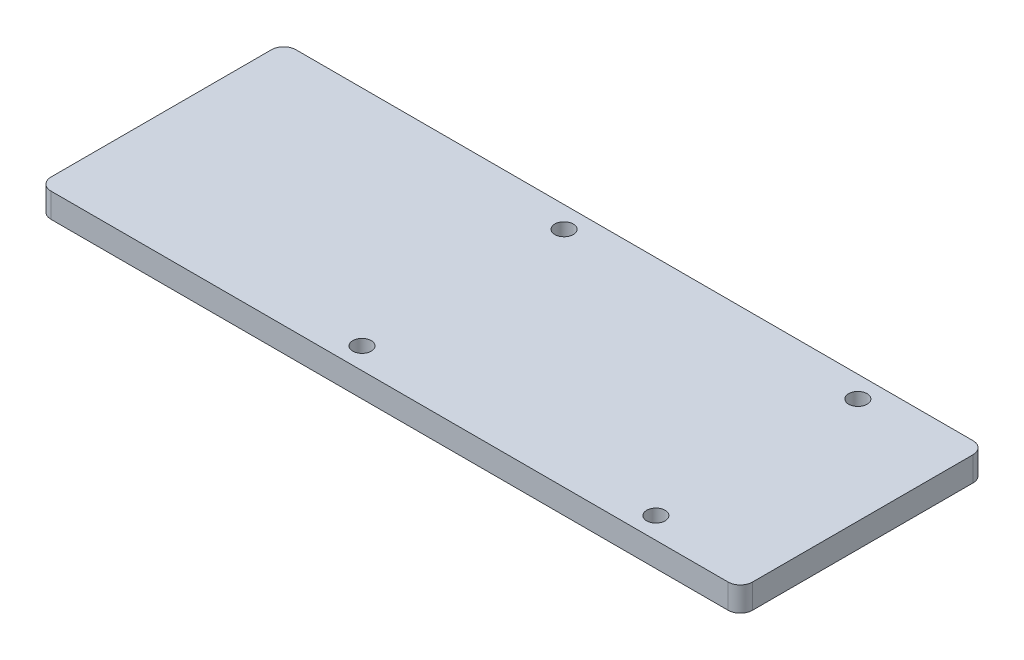
ISO-10303-21;
HEADER;
FILE_DESCRIPTION(('STEP AP214'),'2;1');
FILE_NAME('part.step','',(''),(''),'','','');
FILE_SCHEMA(('AUTOMOTIVE_DESIGN { 1 0 10303 214 1 1 1 1 }'));
ENDSEC;
DATA;
#1=APPLICATION_CONTEXT('core data for automotive mechanical design processes');
#2=APPLICATION_PROTOCOL_DEFINITION('international standard','automotive_design',2000,#1);
#3=PRODUCT_CONTEXT('',#1,'mechanical');
#4=PRODUCT('Part','Part','',(#3));
#5=PRODUCT_RELATED_PRODUCT_CATEGORY('part','',(#4));
#6=PRODUCT_DEFINITION_FORMATION('','',#4);
#7=PRODUCT_DEFINITION_CONTEXT('part definition',#1,'design');
#8=PRODUCT_DEFINITION('design','',#6,#7);
#9=PRODUCT_DEFINITION_SHAPE('','',#8);
#10=(LENGTH_UNIT() NAMED_UNIT(*) SI_UNIT(.MILLI.,.METRE.));
#11=(NAMED_UNIT(*) PLANE_ANGLE_UNIT() SI_UNIT($,.RADIAN.));
#12=(NAMED_UNIT(*) SI_UNIT($,.STERADIAN.) SOLID_ANGLE_UNIT());
#13=UNCERTAINTY_MEASURE_WITH_UNIT(LENGTH_MEASURE(1.E-05),#10,'distance_accuracy_value','');
#14=(GEOMETRIC_REPRESENTATION_CONTEXT(3) GLOBAL_UNCERTAINTY_ASSIGNED_CONTEXT((#13)) GLOBAL_UNIT_ASSIGNED_CONTEXT((#10,
#11,#12)) REPRESENTATION_CONTEXT('',''));
#15=CARTESIAN_POINT('',(0.,0.,0.));
#16=DIRECTION('',(0.,0.,1.));
#17=DIRECTION('',(1.,0.,0.));
#18=AXIS2_PLACEMENT_3D('',#15,#16,#17);
#19=CARTESIAN_POINT('',(181.900000055,12.7,63.5));
#20=DIRECTION('',(-1.,0.,0.));
#21=DIRECTION('',(0.,0.,1.));
#22=AXIS2_PLACEMENT_3D('',#19,#20,#21);
#23=PLANE('',#22);
#24=DIRECTION('',(0.,0.,-1.));
#25=VECTOR('',#24,1.);
#26=CARTESIAN_POINT('',(181.900000055,0.,63.5));
#27=LINE('',#26,#25);
#28=CARTESIAN_POINT('',(181.900000055,0.,57.15));
#29=VERTEX_POINT('',#28);
#30=CARTESIAN_POINT('',(181.900000055,0.,-57.15));
#31=VERTEX_POINT('',#30);
#32=EDGE_CURVE('E128',#29,#31,#27,.T.);
#33=ORIENTED_EDGE('',*,*,#32,.T.);
#34=DIRECTION('',(0.,-1.,0.));
#35=VECTOR('',#34,1.);
#36=CARTESIAN_POINT('',(181.900000055,12.7,-57.15));
#37=LINE('',#36,#35);
#38=CARTESIAN_POINT('',(181.900000055,12.7,-57.15));
#39=VERTEX_POINT('',#38);
#40=EDGE_CURVE('E151',#31,#39,#37,.F.);
#41=ORIENTED_EDGE('',*,*,#40,.T.);
#42=DIRECTION('',(0.,0.,-1.));
#43=VECTOR('',#42,1.);
#44=CARTESIAN_POINT('',(181.900000055,12.7,63.5));
#45=LINE('',#44,#43);
#46=CARTESIAN_POINT('',(181.900000055,12.7,57.15));
#47=VERTEX_POINT('',#46);
#48=EDGE_CURVE('E126',#47,#39,#45,.T.);
#49=ORIENTED_EDGE('',*,*,#48,.F.);
#50=DIRECTION('',(0.,-1.,0.));
#51=VECTOR('',#50,1.);
#52=CARTESIAN_POINT('',(181.900000055,12.7,57.15));
#53=LINE('',#52,#51);
#54=EDGE_CURVE('E148',#47,#29,#53,.T.);
#55=ORIENTED_EDGE('',*,*,#54,.T.);
#56=EDGE_LOOP('',(#33,#41,#49,#55));
#57=FACE_BOUND('',#56,.T.);
#58=ADVANCED_FACE('F33',(#57),#23,.F.);
#59=CARTESIAN_POINT('',(-181.900000055,12.7,-63.5));
#60=DIRECTION('',(0.,0.,1.));
#61=DIRECTION('',(1.,0.,0.));
#62=AXIS2_PLACEMENT_3D('',#59,#60,#61);
#63=PLANE('',#62);
#64=DIRECTION('',(-1.,0.,0.));
#65=VECTOR('',#64,1.);
#66=CARTESIAN_POINT('',(-181.900000055,0.,-63.5));
#67=LINE('',#66,#65);
#68=CARTESIAN_POINT('',(175.550000055,0.,-63.5));
#69=VERTEX_POINT('',#68);
#70=CARTESIAN_POINT('',(-175.550000055,0.,-63.5));
#71=VERTEX_POINT('',#70);
#72=EDGE_CURVE('E124',#69,#71,#67,.T.);
#73=ORIENTED_EDGE('',*,*,#72,.T.);
#74=DIRECTION('',(0.,-1.,0.));
#75=VECTOR('',#74,1.);
#76=CARTESIAN_POINT('',(-175.550000055,12.7,-63.5));
#77=LINE('',#76,#75);
#78=CARTESIAN_POINT('',(-175.550000055,12.7,-63.5));
#79=VERTEX_POINT('',#78);
#80=EDGE_CURVE('E103',#71,#79,#77,.F.);
#81=ORIENTED_EDGE('',*,*,#80,.T.);
#82=DIRECTION('',(-1.,0.,0.));
#83=VECTOR('',#82,1.);
#84=CARTESIAN_POINT('',(-181.900000055,12.7,-63.5));
#85=LINE('',#84,#83);
#86=CARTESIAN_POINT('',(175.550000055,12.7,-63.5));
#87=VERTEX_POINT('',#86);
#88=EDGE_CURVE('E167',#87,#79,#85,.T.);
#89=ORIENTED_EDGE('',*,*,#88,.F.);
#90=DIRECTION('',(0.,-1.,0.));
#91=VECTOR('',#90,1.);
#92=CARTESIAN_POINT('',(175.550000055,12.7,-63.5));
#93=LINE('',#92,#91);
#94=EDGE_CURVE('E108',#87,#69,#93,.T.);
#95=ORIENTED_EDGE('',*,*,#94,.T.);
#96=EDGE_LOOP('',(#73,#81,#89,#95));
#97=FACE_BOUND('',#96,.T.);
#98=ADVANCED_FACE('F219',(#97),#63,.F.);
#99=CARTESIAN_POINT('',(-181.900000055,12.7,63.5));
#100=DIRECTION('',(1.,0.,0.));
#101=DIRECTION('',(0.,0.,-1.));
#102=AXIS2_PLACEMENT_3D('',#99,#100,#101);
#103=PLANE('',#102);
#104=DIRECTION('',(0.,0.,1.));
#105=VECTOR('',#104,1.);
#106=CARTESIAN_POINT('',(-181.900000055,12.7,63.5));
#107=LINE('',#106,#105);
#108=CARTESIAN_POINT('',(-181.900000055,12.7,-57.15));
#109=VERTEX_POINT('',#108);
#110=CARTESIAN_POINT('',(-181.900000055,12.7,57.15));
#111=VERTEX_POINT('',#110);
#112=EDGE_CURVE('E117',#109,#111,#107,.T.);
#113=ORIENTED_EDGE('',*,*,#112,.F.);
#114=DIRECTION('',(0.,-1.,0.));
#115=VECTOR('',#114,1.);
#116=CARTESIAN_POINT('',(-181.900000055,12.7,-57.15));
#117=LINE('',#116,#115);
#118=CARTESIAN_POINT('',(-181.900000055,0.,-57.15));
#119=VERTEX_POINT('',#118);
#120=EDGE_CURVE('E102',#109,#119,#117,.T.);
#121=ORIENTED_EDGE('',*,*,#120,.T.);
#122=DIRECTION('',(0.,0.,1.));
#123=VECTOR('',#122,1.);
#124=CARTESIAN_POINT('',(-181.900000055,0.,63.5));
#125=LINE('',#124,#123);
#126=CARTESIAN_POINT('',(-181.900000055,0.,57.15));
#127=VERTEX_POINT('',#126);
#128=EDGE_CURVE('E115',#119,#127,#125,.T.);
#129=ORIENTED_EDGE('',*,*,#128,.T.);
#130=DIRECTION('',(0.,-1.,0.));
#131=VECTOR('',#130,1.);
#132=CARTESIAN_POINT('',(-181.900000055,12.7,57.15));
#133=LINE('',#132,#131);
#134=EDGE_CURVE('E119',#127,#111,#133,.F.);
#135=ORIENTED_EDGE('',*,*,#134,.T.);
#136=EDGE_LOOP('',(#113,#121,#129,#135));
#137=FACE_BOUND('',#136,.T.);
#138=ADVANCED_FACE('F114',(#137),#103,.F.);
#139=CARTESIAN_POINT('',(-181.900000055,12.7,63.5));
#140=DIRECTION('',(0.,0.,-1.));
#141=DIRECTION('',(-1.,0.,0.));
#142=AXIS2_PLACEMENT_3D('',#139,#140,#141);
#143=PLANE('',#142);
#144=DIRECTION('',(1.,0.,0.));
#145=VECTOR('',#144,1.);
#146=CARTESIAN_POINT('',(-181.900000055,0.,63.5));
#147=LINE('',#146,#145);
#148=CARTESIAN_POINT('',(-175.550000055,0.,63.5));
#149=VERTEX_POINT('',#148);
#150=CARTESIAN_POINT('',(175.550000055,0.,63.5));
#151=VERTEX_POINT('',#150);
#152=EDGE_CURVE('E123',#149,#151,#147,.T.);
#153=ORIENTED_EDGE('',*,*,#152,.T.);
#154=DIRECTION('',(0.,-1.,0.));
#155=VECTOR('',#154,1.);
#156=CARTESIAN_POINT('',(175.550000055,12.7,63.5));
#157=LINE('',#156,#155);
#158=CARTESIAN_POINT('',(175.550000055,12.7,63.5));
#159=VERTEX_POINT('',#158);
#160=EDGE_CURVE('E11',#151,#159,#157,.F.);
#161=ORIENTED_EDGE('',*,*,#160,.T.);
#162=DIRECTION('',(1.,0.,0.));
#163=VECTOR('',#162,1.);
#164=CARTESIAN_POINT('',(-181.900000055,12.7,63.5));
#165=LINE('',#164,#163);
#166=CARTESIAN_POINT('',(-175.550000055,12.7,63.5));
#167=VERTEX_POINT('',#166);
#168=EDGE_CURVE('E132',#167,#159,#165,.T.);
#169=ORIENTED_EDGE('',*,*,#168,.F.);
#170=DIRECTION('',(0.,-1.,0.));
#171=VECTOR('',#170,1.);
#172=CARTESIAN_POINT('',(-175.550000055,12.7,63.5));
#173=LINE('',#172,#171);
#174=EDGE_CURVE('E41',#167,#149,#173,.T.);
#175=ORIENTED_EDGE('',*,*,#174,.T.);
#176=EDGE_LOOP('',(#153,#161,#169,#175));
#177=FACE_BOUND('',#176,.T.);
#178=ADVANCED_FACE('F154',(#177),#143,.F.);
#179=CARTESIAN_POINT('',(0.,12.7,0.));
#180=DIRECTION('',(0.,-1.,0.));
#181=DIRECTION('',(0.,0.,-1.));
#182=AXIS2_PLACEMENT_3D('',#179,#180,#181);
#183=PLANE('',#182);
#184=CARTESIAN_POINT('',(127.,12.7,-52.3748000000001));
#185=DIRECTION('',(0.,1.,0.));
#186=DIRECTION('',(0.,0.,-1.));
#187=AXIS2_PLACEMENT_3D('',#184,#185,#186);
#188=CIRCLE('',#187,4.77520000000001);
#189=CARTESIAN_POINT('',(127.,12.7,-57.1500000000001));
#190=VERTEX_POINT('',#189);
#191=EDGE_CURVE('E183',#190,#190,#188,.T.);
#192=ORIENTED_EDGE('',*,*,#191,.F.);
#193=EDGE_LOOP('',(#192));
#194=FACE_BOUND('',#193,.T.);
#195=CARTESIAN_POINT('',(127.,12.7,52.3748));
#196=DIRECTION('',(0.,1.,0.));
#197=DIRECTION('',(0.,0.,1.));
#198=AXIS2_PLACEMENT_3D('',#195,#196,#197);
#199=CIRCLE('',#198,4.77520000000001);
#200=CARTESIAN_POINT('',(127.,12.7,57.15));
#201=VERTEX_POINT('',#200);
#202=EDGE_CURVE('E189',#201,#201,#199,.T.);
#203=ORIENTED_EDGE('',*,*,#202,.F.);
#204=EDGE_LOOP('',(#203));
#205=FACE_BOUND('',#204,.T.);
#206=CARTESIAN_POINT('',(-25.4,12.7,52.3748));
#207=DIRECTION('',(0.,1.,0.));
#208=DIRECTION('',(0.,0.,-1.));
#209=AXIS2_PLACEMENT_3D('',#206,#207,#208);
#210=CIRCLE('',#209,4.77520000000001);
#211=CARTESIAN_POINT('',(-25.4,12.7,47.5996));
#212=VERTEX_POINT('',#211);
#213=EDGE_CURVE('E195',#212,#212,#210,.T.);
#214=ORIENTED_EDGE('',*,*,#213,.F.);
#215=EDGE_LOOP('',(#214));
#216=FACE_BOUND('',#215,.T.);
#217=CARTESIAN_POINT('',(-25.4,12.7,-52.3748));
#218=DIRECTION('',(0.,1.,0.));
#219=DIRECTION('',(0.,0.,1.));
#220=AXIS2_PLACEMENT_3D('',#217,#218,#219);
#221=CIRCLE('',#220,4.7752);
#222=CARTESIAN_POINT('',(-25.4,12.7,-47.5996));
#223=VERTEX_POINT('',#222);
#224=EDGE_CURVE('E172',#223,#223,#221,.T.);
#225=ORIENTED_EDGE('',*,*,#224,.F.);
#226=EDGE_LOOP('',(#225));
#227=FACE_BOUND('',#226,.T.);
#228=ORIENTED_EDGE('',*,*,#88,.T.);
#229=CARTESIAN_POINT('',(-175.550000055,12.7,-57.15));
#230=DIRECTION('',(0.,-1.,0.));
#231=DIRECTION('',(0.,0.,-1.));
#232=AXIS2_PLACEMENT_3D('',#229,#230,#231);
#233=CIRCLE('',#232,6.35);
#234=EDGE_CURVE('E146',#79,#109,#233,.F.);
#235=ORIENTED_EDGE('',*,*,#234,.T.);
#236=ORIENTED_EDGE('',*,*,#112,.T.);
#237=CARTESIAN_POINT('',(-175.550000055,12.7,57.15));
#238=DIRECTION('',(0.,-1.,0.));
#239=DIRECTION('',(0.,0.,-1.));
#240=AXIS2_PLACEMENT_3D('',#237,#238,#239);
#241=CIRCLE('',#240,6.35);
#242=EDGE_CURVE('E53',#111,#167,#241,.F.);
#243=ORIENTED_EDGE('',*,*,#242,.T.);
#244=ORIENTED_EDGE('',*,*,#168,.T.);
#245=CARTESIAN_POINT('',(175.550000055,12.7,57.15));
#246=DIRECTION('',(0.,-1.,0.));
#247=DIRECTION('',(0.,0.,-1.));
#248=AXIS2_PLACEMENT_3D('',#245,#246,#247);
#249=CIRCLE('',#248,6.35);
#250=EDGE_CURVE('E142',#159,#47,#249,.F.);
#251=ORIENTED_EDGE('',*,*,#250,.T.);
#252=ORIENTED_EDGE('',*,*,#48,.T.);
#253=CARTESIAN_POINT('',(175.550000055,12.7,-57.15));
#254=DIRECTION('',(0.,-1.,0.));
#255=DIRECTION('',(0.,0.,-1.));
#256=AXIS2_PLACEMENT_3D('',#253,#254,#255);
#257=CIRCLE('',#256,6.35);
#258=EDGE_CURVE('E144',#39,#87,#257,.F.);
#259=ORIENTED_EDGE('',*,*,#258,.T.);
#260=EDGE_LOOP('',(#228,#235,#236,#243,#244,#251,#252,#259));
#261=FACE_BOUND('',#260,.T.);
#262=ADVANCED_FACE('F210',(#194,#205,#216,#227,#261),#183,.F.);
#263=CARTESIAN_POINT('',(0.,0.,0.));
#264=DIRECTION('',(0.,-1.,0.));
#265=DIRECTION('',(0.,0.,-1.));
#266=AXIS2_PLACEMENT_3D('',#263,#264,#265);
#267=PLANE('',#266);
#268=CARTESIAN_POINT('',(127.,0.,-52.3748000000001));
#269=DIRECTION('',(0.,1.,0.));
#270=DIRECTION('',(0.,0.,-1.));
#271=AXIS2_PLACEMENT_3D('',#268,#269,#270);
#272=CIRCLE('',#271,4.77520000000001);
#273=CARTESIAN_POINT('',(127.,0.,-57.1500000000001));
#274=VERTEX_POINT('',#273);
#275=EDGE_CURVE('E186',#274,#274,#272,.T.);
#276=ORIENTED_EDGE('',*,*,#275,.T.);
#277=EDGE_LOOP('',(#276));
#278=FACE_BOUND('',#277,.T.);
#279=CARTESIAN_POINT('',(127.,0.,52.3748));
#280=DIRECTION('',(0.,1.,0.));
#281=DIRECTION('',(0.,0.,1.));
#282=AXIS2_PLACEMENT_3D('',#279,#280,#281);
#283=CIRCLE('',#282,4.77520000000001);
#284=CARTESIAN_POINT('',(127.,0.,57.15));
#285=VERTEX_POINT('',#284);
#286=EDGE_CURVE('E192',#285,#285,#283,.T.);
#287=ORIENTED_EDGE('',*,*,#286,.T.);
#288=EDGE_LOOP('',(#287));
#289=FACE_BOUND('',#288,.T.);
#290=CARTESIAN_POINT('',(-25.4,0.,52.3748));
#291=DIRECTION('',(0.,1.,0.));
#292=DIRECTION('',(0.,0.,-1.));
#293=AXIS2_PLACEMENT_3D('',#290,#291,#292);
#294=CIRCLE('',#293,4.77520000000001);
#295=CARTESIAN_POINT('',(-25.4,0.,47.5996));
#296=VERTEX_POINT('',#295);
#297=EDGE_CURVE('E181',#296,#296,#294,.T.);
#298=ORIENTED_EDGE('',*,*,#297,.T.);
#299=EDGE_LOOP('',(#298));
#300=FACE_BOUND('',#299,.T.);
#301=CARTESIAN_POINT('',(-25.4,0.,-52.3748));
#302=DIRECTION('',(0.,1.,0.));
#303=DIRECTION('',(0.,0.,1.));
#304=AXIS2_PLACEMENT_3D('',#301,#302,#303);
#305=CIRCLE('',#304,4.7752);
#306=CARTESIAN_POINT('',(-25.4,0.,-47.5996));
#307=VERTEX_POINT('',#306);
#308=EDGE_CURVE('E176',#307,#307,#305,.T.);
#309=ORIENTED_EDGE('',*,*,#308,.T.);
#310=EDGE_LOOP('',(#309));
#311=FACE_BOUND('',#310,.T.);
#312=ORIENTED_EDGE('',*,*,#128,.F.);
#313=CARTESIAN_POINT('',(-175.550000055,0.,-57.15));
#314=DIRECTION('',(0.,-1.,0.));
#315=DIRECTION('',(0.,0.,-1.));
#316=AXIS2_PLACEMENT_3D('',#313,#314,#315);
#317=CIRCLE('',#316,6.35);
#318=EDGE_CURVE('E98',#119,#71,#317,.T.);
#319=ORIENTED_EDGE('',*,*,#318,.T.);
#320=ORIENTED_EDGE('',*,*,#72,.F.);
#321=CARTESIAN_POINT('',(175.550000055,0.,-57.15));
#322=DIRECTION('',(0.,-1.,0.));
#323=DIRECTION('',(0.,0.,-1.));
#324=AXIS2_PLACEMENT_3D('',#321,#322,#323);
#325=CIRCLE('',#324,6.35);
#326=EDGE_CURVE('E109',#69,#31,#325,.T.);
#327=ORIENTED_EDGE('',*,*,#326,.T.);
#328=ORIENTED_EDGE('',*,*,#32,.F.);
#329=CARTESIAN_POINT('',(175.550000055,0.,57.15));
#330=DIRECTION('',(0.,-1.,0.));
#331=DIRECTION('',(0.,0.,-1.));
#332=AXIS2_PLACEMENT_3D('',#329,#330,#331);
#333=CIRCLE('',#332,6.35);
#334=EDGE_CURVE('E135',#29,#151,#333,.T.);
#335=ORIENTED_EDGE('',*,*,#334,.T.);
#336=ORIENTED_EDGE('',*,*,#152,.F.);
#337=CARTESIAN_POINT('',(-175.550000055,0.,57.15));
#338=DIRECTION('',(0.,-1.,0.));
#339=DIRECTION('',(0.,0.,-1.));
#340=AXIS2_PLACEMENT_3D('',#337,#338,#339);
#341=CIRCLE('',#340,6.35);
#342=EDGE_CURVE('E118',#149,#127,#341,.T.);
#343=ORIENTED_EDGE('',*,*,#342,.T.);
#344=EDGE_LOOP('',(#312,#319,#320,#327,#328,#335,#336,#343));
#345=FACE_BOUND('',#344,.T.);
#346=ADVANCED_FACE('F121',(#278,#289,#300,#311,#345),#267,.T.);
#347=CARTESIAN_POINT('',(-175.550000055,12.7,-57.15));
#348=DIRECTION('',(0.,-1.,0.));
#349=DIRECTION('',(0.,0.,-1.));
#350=AXIS2_PLACEMENT_3D('',#347,#348,#349);
#351=CYLINDRICAL_SURFACE('',#350,6.35);
#352=ORIENTED_EDGE('',*,*,#234,.F.);
#353=ORIENTED_EDGE('',*,*,#80,.F.);
#354=ORIENTED_EDGE('',*,*,#318,.F.);
#355=ORIENTED_EDGE('',*,*,#120,.F.);
#356=EDGE_LOOP('',(#352,#353,#354,#355));
#357=FACE_BOUND('',#356,.T.);
#358=ADVANCED_FACE('F101',(#357),#351,.T.);
#359=CARTESIAN_POINT('',(175.550000055,12.7,-57.15));
#360=DIRECTION('',(0.,-1.,0.));
#361=DIRECTION('',(0.,0.,-1.));
#362=AXIS2_PLACEMENT_3D('',#359,#360,#361);
#363=CYLINDRICAL_SURFACE('',#362,6.35);
#364=ORIENTED_EDGE('',*,*,#258,.F.);
#365=ORIENTED_EDGE('',*,*,#40,.F.);
#366=ORIENTED_EDGE('',*,*,#326,.F.);
#367=ORIENTED_EDGE('',*,*,#94,.F.);
#368=EDGE_LOOP('',(#364,#365,#366,#367));
#369=FACE_BOUND('',#368,.T.);
#370=ADVANCED_FACE('F221',(#369),#363,.T.);
#371=CARTESIAN_POINT('',(175.550000055,12.7,57.15));
#372=DIRECTION('',(0.,-1.,0.));
#373=DIRECTION('',(0.,0.,-1.));
#374=AXIS2_PLACEMENT_3D('',#371,#372,#373);
#375=CYLINDRICAL_SURFACE('',#374,6.35);
#376=ORIENTED_EDGE('',*,*,#250,.F.);
#377=ORIENTED_EDGE('',*,*,#160,.F.);
#378=ORIENTED_EDGE('',*,*,#334,.F.);
#379=ORIENTED_EDGE('',*,*,#54,.F.);
#380=EDGE_LOOP('',(#376,#377,#378,#379));
#381=FACE_BOUND('',#380,.T.);
#382=ADVANCED_FACE('F161',(#381),#375,.T.);
#383=CARTESIAN_POINT('',(-175.550000055,12.7,57.15));
#384=DIRECTION('',(0.,-1.,0.));
#385=DIRECTION('',(0.,0.,-1.));
#386=AXIS2_PLACEMENT_3D('',#383,#384,#385);
#387=CYLINDRICAL_SURFACE('',#386,6.35);
#388=ORIENTED_EDGE('',*,*,#242,.F.);
#389=ORIENTED_EDGE('',*,*,#134,.F.);
#390=ORIENTED_EDGE('',*,*,#342,.F.);
#391=ORIENTED_EDGE('',*,*,#174,.F.);
#392=EDGE_LOOP('',(#388,#389,#390,#391));
#393=FACE_BOUND('',#392,.T.);
#394=ADVANCED_FACE('F35',(#393),#387,.T.);
#395=CARTESIAN_POINT('',(-25.4,0.,-52.3748));
#396=DIRECTION('',(0.,1.,0.));
#397=DIRECTION('',(0.,0.,1.));
#398=AXIS2_PLACEMENT_3D('',#395,#396,#397);
#399=CYLINDRICAL_SURFACE('',#398,4.7752);
#400=ORIENTED_EDGE('',*,*,#308,.F.);
#401=EDGE_LOOP('',(#400));
#402=FACE_BOUND('',#401,.T.);
#403=ORIENTED_EDGE('',*,*,#224,.T.);
#404=EDGE_LOOP('',(#403));
#405=FACE_BOUND('',#404,.T.);
#406=ADVANCED_FACE('F206',(#402,#405),#399,.F.);
#407=CARTESIAN_POINT('',(-25.4,0.,52.3748));
#408=DIRECTION('',(0.,1.,0.));
#409=DIRECTION('',(0.,0.,1.));
#410=AXIS2_PLACEMENT_3D('',#407,#408,#409);
#411=CYLINDRICAL_SURFACE('',#410,4.77520000000001);
#412=ORIENTED_EDGE('',*,*,#297,.F.);
#413=EDGE_LOOP('',(#412));
#414=FACE_BOUND('',#413,.T.);
#415=ORIENTED_EDGE('',*,*,#213,.T.);
#416=EDGE_LOOP('',(#415));
#417=FACE_BOUND('',#416,.T.);
#418=ADVANCED_FACE('F202',(#414,#417),#411,.F.);
#419=CARTESIAN_POINT('',(127.,0.,52.3748));
#420=DIRECTION('',(0.,1.,0.));
#421=DIRECTION('',(0.,0.,1.));
#422=AXIS2_PLACEMENT_3D('',#419,#420,#421);
#423=CYLINDRICAL_SURFACE('',#422,4.77520000000001);
#424=ORIENTED_EDGE('',*,*,#286,.F.);
#425=EDGE_LOOP('',(#424));
#426=FACE_BOUND('',#425,.T.);
#427=ORIENTED_EDGE('',*,*,#202,.T.);
#428=EDGE_LOOP('',(#427));
#429=FACE_BOUND('',#428,.T.);
#430=ADVANCED_FACE('F205',(#426,#429),#423,.F.);
#431=CARTESIAN_POINT('',(127.,0.,-52.3748000000001));
#432=DIRECTION('',(0.,1.,0.));
#433=DIRECTION('',(0.,0.,1.));
#434=AXIS2_PLACEMENT_3D('',#431,#432,#433);
#435=CYLINDRICAL_SURFACE('',#434,4.77520000000001);
#436=ORIENTED_EDGE('',*,*,#275,.F.);
#437=EDGE_LOOP('',(#436));
#438=FACE_BOUND('',#437,.T.);
#439=ORIENTED_EDGE('',*,*,#191,.T.);
#440=EDGE_LOOP('',(#439));
#441=FACE_BOUND('',#440,.T.);
#442=ADVANCED_FACE('F246',(#438,#441),#435,.F.);
#443=CLOSED_SHELL('',(#58,#98,#138,#178,#262,#346,#358,#370,#382,#394,#406,#418,#430,#442));
#444=MANIFOLD_SOLID_BREP('B2',#443);
#445=ADVANCED_BREP_SHAPE_REPRESENTATION('',(#18,#444),#14);
#446=SHAPE_DEFINITION_REPRESENTATION(#9,#445);
ENDSEC;
END-ISO-10303-21;
